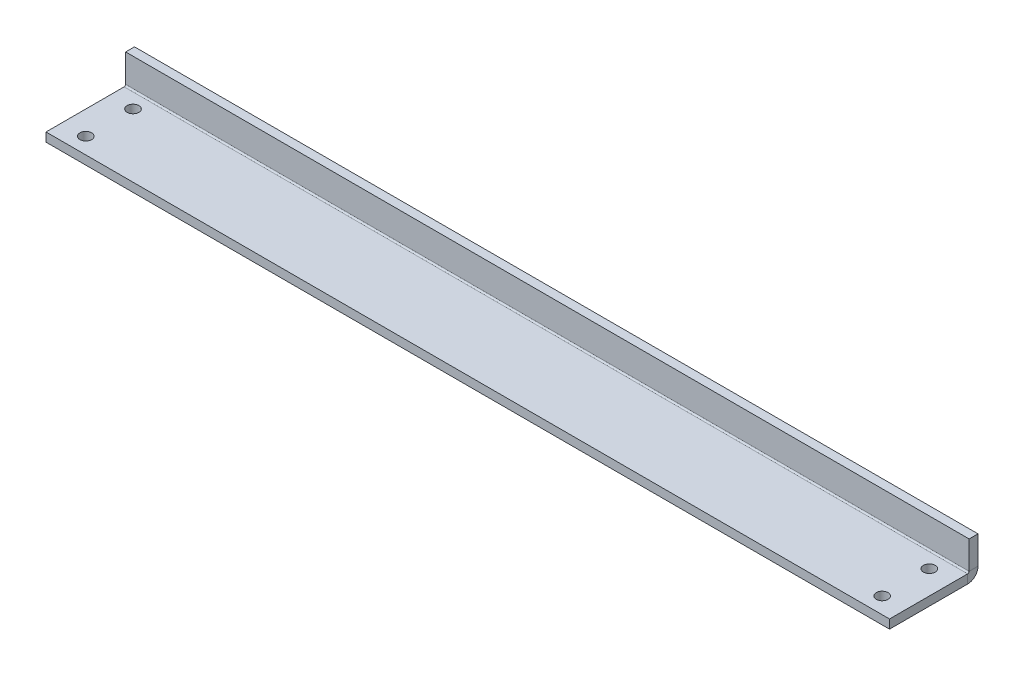
ISO-10303-21;
HEADER;
FILE_DESCRIPTION(('STEP AP214'),'2;1');
FILE_NAME('part.step','',(''),(''),'','','');
FILE_SCHEMA(('AUTOMOTIVE_DESIGN { 1 0 10303 214 1 1 1 1 }'));
ENDSEC;
DATA;
#1=APPLICATION_CONTEXT('core data for automotive mechanical design processes');
#2=APPLICATION_PROTOCOL_DEFINITION('international standard','automotive_design',2000,#1);
#3=PRODUCT_CONTEXT('',#1,'mechanical');
#4=PRODUCT('Part','Part','',(#3));
#5=PRODUCT_RELATED_PRODUCT_CATEGORY('part','',(#4));
#6=PRODUCT_DEFINITION_FORMATION('','',#4);
#7=PRODUCT_DEFINITION_CONTEXT('part definition',#1,'design');
#8=PRODUCT_DEFINITION('design','',#6,#7);
#9=PRODUCT_DEFINITION_SHAPE('','',#8);
#10=(LENGTH_UNIT() NAMED_UNIT(*) SI_UNIT(.MILLI.,.METRE.));
#11=(NAMED_UNIT(*) PLANE_ANGLE_UNIT() SI_UNIT($,.RADIAN.));
#12=(NAMED_UNIT(*) SI_UNIT($,.STERADIAN.) SOLID_ANGLE_UNIT());
#13=UNCERTAINTY_MEASURE_WITH_UNIT(LENGTH_MEASURE(1.E-05),#10,'distance_accuracy_value','');
#14=(GEOMETRIC_REPRESENTATION_CONTEXT(3) GLOBAL_UNCERTAINTY_ASSIGNED_CONTEXT((#13)) GLOBAL_UNIT_ASSIGNED_CONTEXT((#10,
#11,#12)) REPRESENTATION_CONTEXT('',''));
#15=CARTESIAN_POINT('',(0.,0.,0.));
#16=DIRECTION('',(0.,0.,1.));
#17=DIRECTION('',(1.,0.,0.));
#18=AXIS2_PLACEMENT_3D('',#15,#16,#17);
#19=CARTESIAN_POINT('',(-286.,3.,0.));
#20=DIRECTION('',(-1.,0.,0.));
#21=DIRECTION('',(0.,0.,1.));
#22=AXIS2_PLACEMENT_3D('',#19,#20,#21);
#23=PLANE('',#22);
#24=DIRECTION('',(0.,0.,1.));
#25=VECTOR('',#24,1.);
#26=CARTESIAN_POINT('',(-286.,3.,0.));
#27=LINE('',#26,#25);
#28=CARTESIAN_POINT('',(-286.,3.,-26.5));
#29=VERTEX_POINT('',#28);
#30=CARTESIAN_POINT('',(-286.,3.,0.));
#31=VERTEX_POINT('',#30);
#32=EDGE_CURVE('E183',#29,#31,#27,.T.);
#33=ORIENTED_EDGE('',*,*,#32,.F.);
#34=DIRECTION('',(0.,-1.,0.));
#35=VECTOR('',#34,1.);
#36=CARTESIAN_POINT('',(-286.,2.99999999999998,-26.5));
#37=LINE('',#36,#35);
#38=CARTESIAN_POINT('',(-286.,0.,-26.4999999999998));
#39=VERTEX_POINT('',#38);
#40=EDGE_CURVE('E165',#29,#39,#37,.T.);
#41=ORIENTED_EDGE('',*,*,#40,.T.);
#42=DIRECTION('',(0.,0.,1.));
#43=VECTOR('',#42,1.);
#44=CARTESIAN_POINT('',(-286.,0.,0.));
#45=LINE('',#44,#43);
#46=CARTESIAN_POINT('',(-286.,0.,0.));
#47=VERTEX_POINT('',#46);
#48=EDGE_CURVE('E201',#39,#47,#45,.T.);
#49=ORIENTED_EDGE('',*,*,#48,.T.);
#50=DIRECTION('',(0.,1.,0.));
#51=VECTOR('',#50,1.);
#52=CARTESIAN_POINT('',(-286.,3.,0.));
#53=LINE('',#52,#51);
#54=EDGE_CURVE('E11',#47,#31,#53,.T.);
#55=ORIENTED_EDGE('',*,*,#54,.T.);
#56=EDGE_LOOP('',(#33,#41,#49,#55));
#57=FACE_BOUND('',#56,.T.);
#58=ADVANCED_FACE('F45',(#57),#23,.T.);
#59=CARTESIAN_POINT('',(0.,3.,0.));
#60=DIRECTION('',(0.,1.,0.));
#61=DIRECTION('',(0.,0.,1.));
#62=AXIS2_PLACEMENT_3D('',#59,#60,#61);
#63=PLANE('',#62);
#64=CARTESIAN_POINT('',(-8.00000000000001,3.,-21.5));
#65=DIRECTION('',(0.,1.,0.));
#66=DIRECTION('',(0.,0.,-1.));
#67=AXIS2_PLACEMENT_3D('',#64,#65,#66);
#68=CIRCLE('',#67,2.);
#69=CARTESIAN_POINT('',(-8.00000000000001,3.,-23.5));
#70=VERTEX_POINT('',#69);
#71=EDGE_CURVE('E174',#70,#70,#68,.T.);
#72=ORIENTED_EDGE('',*,*,#71,.F.);
#73=EDGE_LOOP('',(#72));
#74=FACE_BOUND('',#73,.T.);
#75=CARTESIAN_POINT('',(-278.,3.,-21.5));
#76=DIRECTION('',(0.,1.,0.));
#77=DIRECTION('',(0.,0.,1.));
#78=AXIS2_PLACEMENT_3D('',#75,#76,#77);
#79=CIRCLE('',#78,2.);
#80=CARTESIAN_POINT('',(-278.,3.,-19.5));
#81=VERTEX_POINT('',#80);
#82=EDGE_CURVE('E177',#81,#81,#79,.T.);
#83=ORIENTED_EDGE('',*,*,#82,.F.);
#84=EDGE_LOOP('',(#83));
#85=FACE_BOUND('',#84,.T.);
#86=CARTESIAN_POINT('',(-278.,3.,-5.5));
#87=DIRECTION('',(0.,1.,0.));
#88=DIRECTION('',(0.,0.,1.));
#89=AXIS2_PLACEMENT_3D('',#86,#87,#88);
#90=CIRCLE('',#89,2.);
#91=CARTESIAN_POINT('',(-278.,3.,-3.50000000000001));
#92=VERTEX_POINT('',#91);
#93=EDGE_CURVE('E188',#92,#92,#90,.T.);
#94=ORIENTED_EDGE('',*,*,#93,.F.);
#95=EDGE_LOOP('',(#94));
#96=FACE_BOUND('',#95,.T.);
#97=CARTESIAN_POINT('',(-8.00000000000001,3.,-5.5));
#98=DIRECTION('',(0.,1.,0.));
#99=DIRECTION('',(0.,0.,-1.));
#100=AXIS2_PLACEMENT_3D('',#97,#98,#99);
#101=CIRCLE('',#100,2.);
#102=CARTESIAN_POINT('',(-8.00000000000001,3.,-7.5));
#103=VERTEX_POINT('',#102);
#104=EDGE_CURVE('E191',#103,#103,#101,.T.);
#105=ORIENTED_EDGE('',*,*,#104,.F.);
#106=EDGE_LOOP('',(#105));
#107=FACE_BOUND('',#106,.T.);
#108=DIRECTION('',(0.,0.,-1.));
#109=VECTOR('',#108,1.);
#110=CARTESIAN_POINT('',(0.,3.,0.));
#111=LINE('',#110,#109);
#112=CARTESIAN_POINT('',(0.,3.,0.));
#113=VERTEX_POINT('',#112);
#114=CARTESIAN_POINT('',(0.,3.,-26.5));
#115=VERTEX_POINT('',#114);
#116=EDGE_CURVE('E181',#113,#115,#111,.T.);
#117=ORIENTED_EDGE('',*,*,#116,.T.);
#118=DIRECTION('',(-1.,0.,0.));
#119=VECTOR('',#118,1.);
#120=CARTESIAN_POINT('',(-286.,2.99999999999998,-26.5));
#121=LINE('',#120,#119);
#122=EDGE_CURVE('E60',#29,#115,#121,.F.);
#123=ORIENTED_EDGE('',*,*,#122,.F.);
#124=ORIENTED_EDGE('',*,*,#32,.T.);
#125=DIRECTION('',(1.,0.,0.));
#126=VECTOR('',#125,1.);
#127=CARTESIAN_POINT('',(0.,3.,0.));
#128=LINE('',#127,#126);
#129=EDGE_CURVE('E185',#31,#113,#128,.T.);
#130=ORIENTED_EDGE('',*,*,#129,.T.);
#131=EDGE_LOOP('',(#117,#123,#124,#130));
#132=FACE_BOUND('',#131,.T.);
#133=ADVANCED_FACE('F217',(#74,#85,#96,#107,#132),#63,.T.);
#134=CARTESIAN_POINT('',(0.,0.,0.));
#135=DIRECTION('',(0.,1.,0.));
#136=DIRECTION('',(0.,0.,1.));
#137=AXIS2_PLACEMENT_3D('',#134,#135,#136);
#138=PLANE('',#137);
#139=CARTESIAN_POINT('',(-8.00000000000001,0.,-5.5));
#140=DIRECTION('',(0.,1.,0.));
#141=DIRECTION('',(0.,0.,1.));
#142=AXIS2_PLACEMENT_3D('',#139,#140,#141);
#143=CIRCLE('',#142,2.);
#144=CARTESIAN_POINT('',(-8.00000000000001,0.,-3.50000000000001));
#145=VERTEX_POINT('',#144);
#146=EDGE_CURVE('E178',#145,#145,#143,.T.);
#147=ORIENTED_EDGE('',*,*,#146,.T.);
#148=EDGE_LOOP('',(#147));
#149=FACE_BOUND('',#148,.T.);
#150=CARTESIAN_POINT('',(-278.,0.,-5.5));
#151=DIRECTION('',(0.,1.,0.));
#152=DIRECTION('',(0.,0.,1.));
#153=AXIS2_PLACEMENT_3D('',#150,#151,#152);
#154=CIRCLE('',#153,2.);
#155=CARTESIAN_POINT('',(-278.,0.,-3.50000000000001));
#156=VERTEX_POINT('',#155);
#157=EDGE_CURVE('E205',#156,#156,#154,.T.);
#158=ORIENTED_EDGE('',*,*,#157,.T.);
#159=EDGE_LOOP('',(#158));
#160=FACE_BOUND('',#159,.T.);
#161=CARTESIAN_POINT('',(-278.,0.,-21.5));
#162=DIRECTION('',(0.,1.,0.));
#163=DIRECTION('',(0.,0.,1.));
#164=AXIS2_PLACEMENT_3D('',#161,#162,#163);
#165=CIRCLE('',#164,2.);
#166=CARTESIAN_POINT('',(-278.,0.,-19.5));
#167=VERTEX_POINT('',#166);
#168=EDGE_CURVE('E196',#167,#167,#165,.T.);
#169=ORIENTED_EDGE('',*,*,#168,.T.);
#170=EDGE_LOOP('',(#169));
#171=FACE_BOUND('',#170,.T.);
#172=CARTESIAN_POINT('',(-8.00000000000001,0.,-21.5));
#173=DIRECTION('',(0.,1.,0.));
#174=DIRECTION('',(0.,0.,1.));
#175=AXIS2_PLACEMENT_3D('',#172,#173,#174);
#176=CIRCLE('',#175,2.);
#177=CARTESIAN_POINT('',(-8.00000000000001,0.,-19.5));
#178=VERTEX_POINT('',#177);
#179=EDGE_CURVE('E172',#178,#178,#176,.T.);
#180=ORIENTED_EDGE('',*,*,#179,.T.);
#181=EDGE_LOOP('',(#180));
#182=FACE_BOUND('',#181,.T.);
#183=DIRECTION('',(-1.,0.,0.));
#184=VECTOR('',#183,1.);
#185=CARTESIAN_POINT('',(-286.,0.,-26.4999999999998));
#186=LINE('',#185,#184);
#187=CARTESIAN_POINT('',(0.,0.,-26.5));
#188=VERTEX_POINT('',#187);
#189=EDGE_CURVE('E119',#39,#188,#186,.F.);
#190=ORIENTED_EDGE('',*,*,#189,.T.);
#191=DIRECTION('',(0.,0.,1.));
#192=VECTOR('',#191,1.);
#193=CARTESIAN_POINT('',(0.,0.,0.));
#194=LINE('',#193,#192);
#195=CARTESIAN_POINT('',(0.,0.,0.));
#196=VERTEX_POINT('',#195);
#197=EDGE_CURVE('E199',#196,#188,#194,.F.);
#198=ORIENTED_EDGE('',*,*,#197,.F.);
#199=DIRECTION('',(1.,0.,0.));
#200=VECTOR('',#199,1.);
#201=CARTESIAN_POINT('',(0.,0.,0.));
#202=LINE('',#201,#200);
#203=EDGE_CURVE('E202',#47,#196,#202,.T.);
#204=ORIENTED_EDGE('',*,*,#203,.F.);
#205=ORIENTED_EDGE('',*,*,#48,.F.);
#206=EDGE_LOOP('',(#190,#198,#204,#205));
#207=FACE_BOUND('',#206,.T.);
#208=ADVANCED_FACE('F221',(#149,#160,#171,#182,#207),#138,.F.);
#209=CARTESIAN_POINT('',(0.,3.,0.));
#210=DIRECTION('',(0.,0.,1.));
#211=DIRECTION('',(1.,0.,0.));
#212=AXIS2_PLACEMENT_3D('',#209,#210,#211);
#213=PLANE('',#212);
#214=ORIENTED_EDGE('',*,*,#54,.F.);
#215=ORIENTED_EDGE('',*,*,#203,.T.);
#216=DIRECTION('',(0.,1.,0.));
#217=VECTOR('',#216,1.);
#218=CARTESIAN_POINT('',(0.,3.,0.));
#219=LINE('',#218,#217);
#220=EDGE_CURVE('E53',#196,#113,#219,.T.);
#221=ORIENTED_EDGE('',*,*,#220,.T.);
#222=ORIENTED_EDGE('',*,*,#129,.F.);
#223=EDGE_LOOP('',(#214,#215,#221,#222));
#224=FACE_BOUND('',#223,.T.);
#225=ADVANCED_FACE('F213',(#224),#213,.T.);
#226=CARTESIAN_POINT('',(0.,3.,0.));
#227=DIRECTION('',(1.,0.,0.));
#228=DIRECTION('',(0.,0.,-1.));
#229=AXIS2_PLACEMENT_3D('',#226,#227,#228);
#230=PLANE('',#229);
#231=DIRECTION('',(0.,-1.,0.));
#232=VECTOR('',#231,1.);
#233=CARTESIAN_POINT('',(0.,2.99999999999998,-26.5));
#234=LINE('',#233,#232);
#235=EDGE_CURVE('E68',#115,#188,#234,.T.);
#236=ORIENTED_EDGE('',*,*,#235,.F.);
#237=ORIENTED_EDGE('',*,*,#116,.F.);
#238=ORIENTED_EDGE('',*,*,#220,.F.);
#239=ORIENTED_EDGE('',*,*,#197,.T.);
#240=EDGE_LOOP('',(#236,#237,#238,#239));
#241=FACE_BOUND('',#240,.T.);
#242=ADVANCED_FACE('F216',(#241),#230,.T.);
#243=CARTESIAN_POINT('',(-8.00000000000001,3.,-21.5));
#244=DIRECTION('',(0.,1.,0.));
#245=DIRECTION('',(0.,0.,1.));
#246=AXIS2_PLACEMENT_3D('',#243,#244,#245);
#247=CYLINDRICAL_SURFACE('',#246,2.);
#248=ORIENTED_EDGE('',*,*,#71,.T.);
#249=EDGE_LOOP('',(#248));
#250=FACE_BOUND('',#249,.T.);
#251=ORIENTED_EDGE('',*,*,#179,.F.);
#252=EDGE_LOOP('',(#251));
#253=FACE_BOUND('',#252,.T.);
#254=ADVANCED_FACE('F265',(#250,#253),#247,.F.);
#255=CARTESIAN_POINT('',(-278.,3.,-21.5));
#256=DIRECTION('',(0.,1.,0.));
#257=DIRECTION('',(0.,0.,1.));
#258=AXIS2_PLACEMENT_3D('',#255,#256,#257);
#259=CYLINDRICAL_SURFACE('',#258,2.);
#260=ORIENTED_EDGE('',*,*,#82,.T.);
#261=EDGE_LOOP('',(#260));
#262=FACE_BOUND('',#261,.T.);
#263=ORIENTED_EDGE('',*,*,#168,.F.);
#264=EDGE_LOOP('',(#263));
#265=FACE_BOUND('',#264,.T.);
#266=ADVANCED_FACE('F259',(#262,#265),#259,.F.);
#267=CARTESIAN_POINT('',(-278.,3.,-5.5));
#268=DIRECTION('',(0.,1.,0.));
#269=DIRECTION('',(0.,0.,1.));
#270=AXIS2_PLACEMENT_3D('',#267,#268,#269);
#271=CYLINDRICAL_SURFACE('',#270,2.);
#272=ORIENTED_EDGE('',*,*,#93,.T.);
#273=EDGE_LOOP('',(#272));
#274=FACE_BOUND('',#273,.T.);
#275=ORIENTED_EDGE('',*,*,#157,.F.);
#276=EDGE_LOOP('',(#275));
#277=FACE_BOUND('',#276,.T.);
#278=ADVANCED_FACE('F257',(#274,#277),#271,.F.);
#279=CARTESIAN_POINT('',(-8.00000000000001,3.,-5.5));
#280=DIRECTION('',(0.,1.,0.));
#281=DIRECTION('',(0.,0.,1.));
#282=AXIS2_PLACEMENT_3D('',#279,#280,#281);
#283=CYLINDRICAL_SURFACE('',#282,2.);
#284=ORIENTED_EDGE('',*,*,#104,.T.);
#285=EDGE_LOOP('',(#284));
#286=FACE_BOUND('',#285,.T.);
#287=ORIENTED_EDGE('',*,*,#146,.F.);
#288=EDGE_LOOP('',(#287));
#289=FACE_BOUND('',#288,.T.);
#290=ADVANCED_FACE('F47',(#286,#289),#283,.F.);
#291=CARTESIAN_POINT('',(0.,3.5,-26.5));
#292=DIRECTION('',(1.,0.,0.));
#293=DIRECTION('',(0.,0.,-1.));
#294=AXIS2_PLACEMENT_3D('',#291,#292,#293);
#295=PLANE('',#294);
#296=DIRECTION('',(0.,0.,-1.));
#297=VECTOR('',#296,1.);
#298=CARTESIAN_POINT('',(0.,3.5,-27.));
#299=LINE('',#298,#297);
#300=CARTESIAN_POINT('',(0.,3.5,-27.));
#301=VERTEX_POINT('',#300);
#302=CARTESIAN_POINT('',(0.,3.49999999999999,-30.));
#303=VERTEX_POINT('',#302);
#304=EDGE_CURVE('E226',#301,#303,#299,.T.);
#305=ORIENTED_EDGE('',*,*,#304,.F.);
#306=CARTESIAN_POINT('',(0.,3.5,-26.5));
#307=DIRECTION('',(-1.,0.,0.));
#308=DIRECTION('',(0.,0.,1.));
#309=AXIS2_PLACEMENT_3D('',#306,#307,#308);
#310=CIRCLE('',#309,0.500000000000021);
#311=EDGE_CURVE('E122',#115,#301,#310,.F.);
#312=ORIENTED_EDGE('',*,*,#311,.F.);
#313=ORIENTED_EDGE('',*,*,#235,.T.);
#314=CARTESIAN_POINT('',(0.,3.5,-26.5));
#315=DIRECTION('',(-1.,0.,0.));
#316=DIRECTION('',(0.,0.,1.));
#317=AXIS2_PLACEMENT_3D('',#314,#315,#316);
#318=CIRCLE('',#317,3.50000000000002);
#319=EDGE_CURVE('E164',#188,#303,#318,.F.);
#320=ORIENTED_EDGE('',*,*,#319,.T.);
#321=EDGE_LOOP('',(#305,#312,#313,#320));
#322=FACE_BOUND('',#321,.T.);
#323=ADVANCED_FACE('F224',(#322),#295,.T.);
#324=CARTESIAN_POINT('',(-286.,3.5,-26.5));
#325=DIRECTION('',(1.,0.,0.));
#326=DIRECTION('',(0.,0.,-1.));
#327=AXIS2_PLACEMENT_3D('',#324,#325,#326);
#328=PLANE('',#327);
#329=CARTESIAN_POINT('',(-286.,3.5,-26.5));
#330=DIRECTION('',(-1.,0.,0.));
#331=DIRECTION('',(0.,0.,1.));
#332=AXIS2_PLACEMENT_3D('',#329,#330,#331);
#333=CIRCLE('',#332,0.500000000000021);
#334=CARTESIAN_POINT('',(-286.,3.5,-27.));
#335=VERTEX_POINT('',#334);
#336=EDGE_CURVE('E129',#335,#29,#333,.T.);
#337=ORIENTED_EDGE('',*,*,#336,.F.);
#338=DIRECTION('',(0.,0.,-1.));
#339=VECTOR('',#338,1.);
#340=CARTESIAN_POINT('',(-286.,3.50000000000001,-27.));
#341=LINE('',#340,#339);
#342=CARTESIAN_POINT('',(-286.,3.50000000000003,-30.));
#343=VERTEX_POINT('',#342);
#344=EDGE_CURVE('E126',#335,#343,#341,.T.);
#345=ORIENTED_EDGE('',*,*,#344,.T.);
#346=CARTESIAN_POINT('',(-286.,3.5,-26.5));
#347=DIRECTION('',(-1.,0.,0.));
#348=DIRECTION('',(0.,0.,1.));
#349=AXIS2_PLACEMENT_3D('',#346,#347,#348);
#350=CIRCLE('',#349,3.50000000000002);
#351=EDGE_CURVE('E112',#343,#39,#350,.T.);
#352=ORIENTED_EDGE('',*,*,#351,.T.);
#353=ORIENTED_EDGE('',*,*,#40,.F.);
#354=EDGE_LOOP('',(#337,#345,#352,#353));
#355=FACE_BOUND('',#354,.T.);
#356=ADVANCED_FACE('F127',(#355),#328,.F.);
#357=CARTESIAN_POINT('',(-286.,3.5,-26.5));
#358=DIRECTION('',(-1.,0.,0.));
#359=DIRECTION('',(0.,0.,-1.));
#360=AXIS2_PLACEMENT_3D('',#357,#358,#359);
#361=CYLINDRICAL_SURFACE('',#360,3.50000000000002);
#362=ORIENTED_EDGE('',*,*,#189,.F.);
#363=ORIENTED_EDGE('',*,*,#351,.F.);
#364=DIRECTION('',(1.,0.,0.));
#365=VECTOR('',#364,1.);
#366=CARTESIAN_POINT('',(0.,3.50000000000002,-30.));
#367=LINE('',#366,#365);
#368=EDGE_CURVE('E117',#343,#303,#367,.T.);
#369=ORIENTED_EDGE('',*,*,#368,.T.);
#370=ORIENTED_EDGE('',*,*,#319,.F.);
#371=EDGE_LOOP('',(#362,#363,#369,#370));
#372=FACE_BOUND('',#371,.T.);
#373=ADVANCED_FACE('F114',(#372),#361,.T.);
#374=CARTESIAN_POINT('',(-286.,3.5,-26.5));
#375=DIRECTION('',(-1.,0.,0.));
#376=DIRECTION('',(0.,0.,-1.));
#377=AXIS2_PLACEMENT_3D('',#374,#375,#376);
#378=CYLINDRICAL_SURFACE('',#377,0.500000000000021);
#379=ORIENTED_EDGE('',*,*,#122,.T.);
#380=ORIENTED_EDGE('',*,*,#311,.T.);
#381=DIRECTION('',(-1.,0.,0.));
#382=VECTOR('',#381,1.);
#383=CARTESIAN_POINT('',(0.,3.5,-27.));
#384=LINE('',#383,#382);
#385=EDGE_CURVE('E133',#301,#335,#384,.T.);
#386=ORIENTED_EDGE('',*,*,#385,.T.);
#387=ORIENTED_EDGE('',*,*,#336,.T.);
#388=EDGE_LOOP('',(#379,#380,#386,#387));
#389=FACE_BOUND('',#388,.T.);
#390=ADVANCED_FACE('F229',(#389),#378,.F.);
#391=CARTESIAN_POINT('',(0.,2.99999999999999,-30.));
#392=DIRECTION('',(-1.,0.,0.));
#393=DIRECTION('',(0.,0.,1.));
#394=AXIS2_PLACEMENT_3D('',#391,#392,#393);
#395=PLANE('',#394);
#396=ORIENTED_EDGE('',*,*,#304,.T.);
#397=DIRECTION('',(0.,-1.,0.));
#398=VECTOR('',#397,1.);
#399=CARTESIAN_POINT('',(0.,2.99999999999999,-30.));
#400=LINE('',#399,#398);
#401=CARTESIAN_POINT('',(0.,13.,-30.));
#402=VERTEX_POINT('',#401);
#403=EDGE_CURVE('E141',#402,#303,#400,.T.);
#404=ORIENTED_EDGE('',*,*,#403,.F.);
#405=DIRECTION('',(0.,0.,1.));
#406=VECTOR('',#405,1.);
#407=CARTESIAN_POINT('',(0.,13.,-30.));
#408=LINE('',#407,#406);
#409=CARTESIAN_POINT('',(0.,13.,-27.));
#410=VERTEX_POINT('',#409);
#411=EDGE_CURVE('E150',#402,#410,#408,.T.);
#412=ORIENTED_EDGE('',*,*,#411,.T.);
#413=DIRECTION('',(0.,-1.,0.));
#414=VECTOR('',#413,1.);
#415=CARTESIAN_POINT('',(0.,3.,-27.));
#416=LINE('',#415,#414);
#417=EDGE_CURVE('E142',#410,#301,#416,.T.);
#418=ORIENTED_EDGE('',*,*,#417,.T.);
#419=EDGE_LOOP('',(#396,#404,#412,#418));
#420=FACE_BOUND('',#419,.T.);
#421=ADVANCED_FACE('F236',(#420),#395,.F.);
#422=CARTESIAN_POINT('',(-286.,13.,-30.));
#423=DIRECTION('',(1.,0.,0.));
#424=DIRECTION('',(0.,0.,-1.));
#425=AXIS2_PLACEMENT_3D('',#422,#423,#424);
#426=PLANE('',#425);
#427=ORIENTED_EDGE('',*,*,#344,.F.);
#428=DIRECTION('',(0.,1.,0.));
#429=VECTOR('',#428,1.);
#430=CARTESIAN_POINT('',(-286.,13.,-27.));
#431=LINE('',#430,#429);
#432=CARTESIAN_POINT('',(-286.,13.,-27.));
#433=VERTEX_POINT('',#432);
#434=EDGE_CURVE('E157',#335,#433,#431,.T.);
#435=ORIENTED_EDGE('',*,*,#434,.T.);
#436=DIRECTION('',(0.,0.,1.));
#437=VECTOR('',#436,1.);
#438=CARTESIAN_POINT('',(-286.,13.,-30.));
#439=LINE('',#438,#437);
#440=CARTESIAN_POINT('',(-286.,13.,-30.));
#441=VERTEX_POINT('',#440);
#442=EDGE_CURVE('E146',#441,#433,#439,.T.);
#443=ORIENTED_EDGE('',*,*,#442,.F.);
#444=DIRECTION('',(0.,1.,0.));
#445=VECTOR('',#444,1.);
#446=CARTESIAN_POINT('',(-286.,13.,-30.));
#447=LINE('',#446,#445);
#448=EDGE_CURVE('E138',#343,#441,#447,.T.);
#449=ORIENTED_EDGE('',*,*,#448,.F.);
#450=EDGE_LOOP('',(#427,#435,#443,#449));
#451=FACE_BOUND('',#450,.T.);
#452=ADVANCED_FACE('F144',(#451),#426,.F.);
#453=CARTESIAN_POINT('',(0.,-1.04149511719277E-13,-30.));
#454=DIRECTION('',(0.,0.,1.));
#455=DIRECTION('',(0.,-1.,0.));
#456=AXIS2_PLACEMENT_3D('',#453,#454,#455);
#457=PLANE('',#456);
#458=ORIENTED_EDGE('',*,*,#368,.F.);
#459=ORIENTED_EDGE('',*,*,#448,.T.);
#460=DIRECTION('',(1.,0.,0.));
#461=VECTOR('',#460,1.);
#462=CARTESIAN_POINT('',(0.,13.,-30.));
#463=LINE('',#462,#461);
#464=EDGE_CURVE('E148',#441,#402,#463,.T.);
#465=ORIENTED_EDGE('',*,*,#464,.T.);
#466=ORIENTED_EDGE('',*,*,#403,.T.);
#467=EDGE_LOOP('',(#458,#459,#465,#466));
#468=FACE_BOUND('',#467,.T.);
#469=ADVANCED_FACE('F137',(#468),#457,.F.);
#470=CARTESIAN_POINT('',(0.,0.,-27.));
#471=DIRECTION('',(0.,0.,1.));
#472=DIRECTION('',(0.,-1.,0.));
#473=AXIS2_PLACEMENT_3D('',#470,#471,#472);
#474=PLANE('',#473);
#475=ORIENTED_EDGE('',*,*,#434,.F.);
#476=ORIENTED_EDGE('',*,*,#385,.F.);
#477=ORIENTED_EDGE('',*,*,#417,.F.);
#478=DIRECTION('',(1.,0.,0.));
#479=VECTOR('',#478,1.);
#480=CARTESIAN_POINT('',(0.,13.,-27.));
#481=LINE('',#480,#479);
#482=EDGE_CURVE('E152',#433,#410,#481,.T.);
#483=ORIENTED_EDGE('',*,*,#482,.F.);
#484=EDGE_LOOP('',(#475,#476,#477,#483));
#485=FACE_BOUND('',#484,.T.);
#486=ADVANCED_FACE('F232',(#485),#474,.T.);
#487=CARTESIAN_POINT('',(0.,13.,-30.));
#488=DIRECTION('',(0.,-1.,0.));
#489=DIRECTION('',(0.,0.,-1.));
#490=AXIS2_PLACEMENT_3D('',#487,#488,#489);
#491=PLANE('',#490);
#492=ORIENTED_EDGE('',*,*,#482,.T.);
#493=ORIENTED_EDGE('',*,*,#411,.F.);
#494=ORIENTED_EDGE('',*,*,#464,.F.);
#495=ORIENTED_EDGE('',*,*,#442,.T.);
#496=EDGE_LOOP('',(#492,#493,#494,#495));
#497=FACE_BOUND('',#496,.T.);
#498=ADVANCED_FACE('F239',(#497),#491,.F.);
#499=CLOSED_SHELL('',(#58,#133,#208,#225,#242,#254,#266,#278,#290,#323,#356,#373,#390,#421,#452,
#469,#486,#498));
#500=MANIFOLD_SOLID_BREP('B2',#499);
#501=ADVANCED_BREP_SHAPE_REPRESENTATION('',(#18,#500),#14);
#502=SHAPE_DEFINITION_REPRESENTATION(#9,#501);
ENDSEC;
END-ISO-10303-21;
